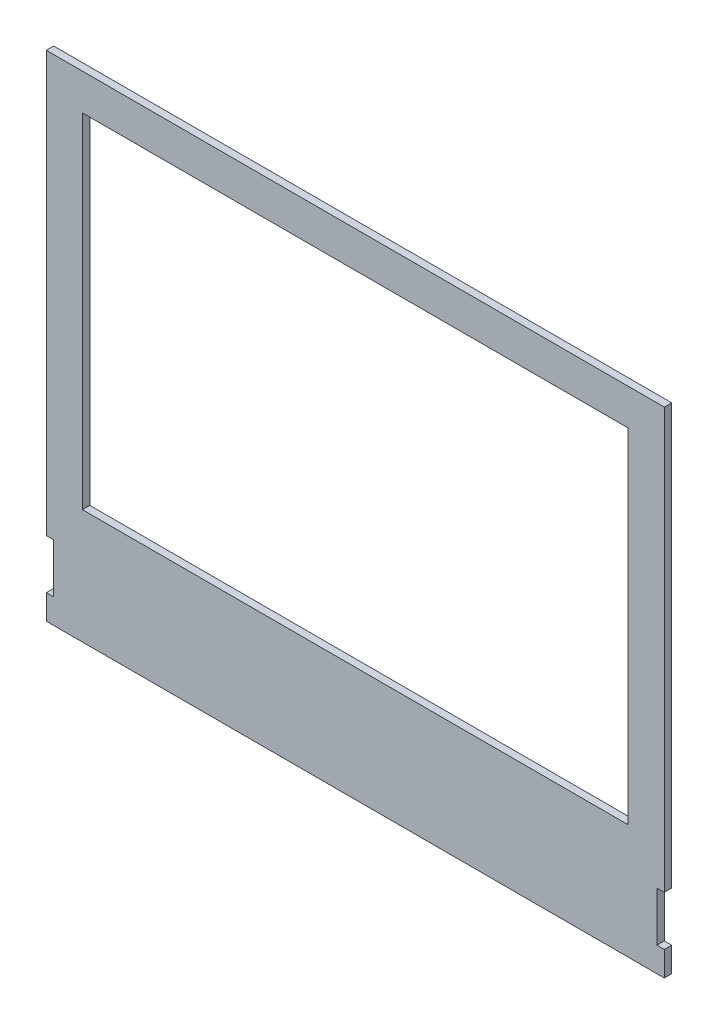
ISO-10303-21;
HEADER;
FILE_DESCRIPTION(('STEP AP214'),'2;1');
FILE_NAME('part.step','',(''),(''),'','','');
FILE_SCHEMA(('AUTOMOTIVE_DESIGN { 1 0 10303 214 1 1 1 1 }'));
ENDSEC;
DATA;
#1=APPLICATION_CONTEXT('core data for automotive mechanical design processes');
#2=APPLICATION_PROTOCOL_DEFINITION('international standard','automotive_design',2000,#1);
#3=PRODUCT_CONTEXT('',#1,'mechanical');
#4=PRODUCT('Part','Part','',(#3));
#5=PRODUCT_RELATED_PRODUCT_CATEGORY('part','',(#4));
#6=PRODUCT_DEFINITION_FORMATION('','',#4);
#7=PRODUCT_DEFINITION_CONTEXT('part definition',#1,'design');
#8=PRODUCT_DEFINITION('design','',#6,#7);
#9=PRODUCT_DEFINITION_SHAPE('','',#8);
#10=(LENGTH_UNIT() NAMED_UNIT(*) SI_UNIT(.MILLI.,.METRE.));
#11=(NAMED_UNIT(*) PLANE_ANGLE_UNIT() SI_UNIT($,.RADIAN.));
#12=(NAMED_UNIT(*) SI_UNIT($,.STERADIAN.) SOLID_ANGLE_UNIT());
#13=UNCERTAINTY_MEASURE_WITH_UNIT(LENGTH_MEASURE(1.E-05),#10,'distance_accuracy_value','');
#14=(GEOMETRIC_REPRESENTATION_CONTEXT(3) GLOBAL_UNCERTAINTY_ASSIGNED_CONTEXT((#13)) GLOBAL_UNIT_ASSIGNED_CONTEXT((#10,
#11,#12)) REPRESENTATION_CONTEXT('',''));
#15=CARTESIAN_POINT('',(0.,0.,0.));
#16=DIRECTION('',(0.,0.,1.));
#17=DIRECTION('',(1.,0.,0.));
#18=AXIS2_PLACEMENT_3D('',#15,#16,#17);
#19=CARTESIAN_POINT('',(250.,0.,3.));
#20=DIRECTION('',(-1.,0.,0.));
#21=DIRECTION('',(0.,0.,1.));
#22=AXIS2_PLACEMENT_3D('',#19,#20,#21);
#23=PLANE('',#22);
#24=DIRECTION('',(0.,1.,0.));
#25=VECTOR('',#24,1.);
#26=CARTESIAN_POINT('',(250.,0.,0.));
#27=LINE('',#26,#25);
#28=CARTESIAN_POINT('',(250.,0.,0.));
#29=VERTEX_POINT('',#28);
#30=CARTESIAN_POINT('',(250.,10.,0.));
#31=VERTEX_POINT('',#30);
#32=EDGE_CURVE('E184',#29,#31,#27,.T.);
#33=ORIENTED_EDGE('',*,*,#32,.T.);
#34=DIRECTION('',(0.,0.,1.));
#35=VECTOR('',#34,1.);
#36=CARTESIAN_POINT('',(250.,10.,-7.));
#37=LINE('',#36,#35);
#38=CARTESIAN_POINT('',(250.,10.,3.));
#39=VERTEX_POINT('',#38);
#40=EDGE_CURVE('E271',#31,#39,#37,.T.);
#41=ORIENTED_EDGE('',*,*,#40,.T.);
#42=DIRECTION('',(0.,1.,0.));
#43=VECTOR('',#42,1.);
#44=CARTESIAN_POINT('',(250.,0.,3.));
#45=LINE('',#44,#43);
#46=CARTESIAN_POINT('',(250.,0.,3.));
#47=VERTEX_POINT('',#46);
#48=EDGE_CURVE('E167',#47,#39,#45,.T.);
#49=ORIENTED_EDGE('',*,*,#48,.F.);
#50=DIRECTION('',(0.,0.,-1.));
#51=VECTOR('',#50,1.);
#52=CARTESIAN_POINT('',(250.,0.,3.));
#53=LINE('',#52,#51);
#54=EDGE_CURVE('E193',#47,#29,#53,.T.);
#55=ORIENTED_EDGE('',*,*,#54,.T.);
#56=EDGE_LOOP('',(#33,#41,#49,#55));
#57=FACE_BOUND('',#56,.T.);
#58=ADVANCED_FACE('F32',(#57),#23,.F.);
#59=CARTESIAN_POINT('',(0.,0.,3.));
#60=DIRECTION('',(1.,0.,0.));
#61=DIRECTION('',(0.,0.,-1.));
#62=AXIS2_PLACEMENT_3D('',#59,#60,#61);
#63=PLANE('',#62);
#64=DIRECTION('',(0.,-1.,0.));
#65=VECTOR('',#64,1.);
#66=CARTESIAN_POINT('',(0.,0.,0.));
#67=LINE('',#66,#65);
#68=CARTESIAN_POINT('',(0.,200.,0.));
#69=VERTEX_POINT('',#68);
#70=CARTESIAN_POINT('',(0.,30.,0.));
#71=VERTEX_POINT('',#70);
#72=EDGE_CURVE('E177',#69,#71,#67,.T.);
#73=ORIENTED_EDGE('',*,*,#72,.T.);
#74=DIRECTION('',(0.,0.,1.));
#75=VECTOR('',#74,1.);
#76=CARTESIAN_POINT('',(0.,30.,-7.));
#77=LINE('',#76,#75);
#78=CARTESIAN_POINT('',(0.,30.,3.));
#79=VERTEX_POINT('',#78);
#80=EDGE_CURVE('E249',#71,#79,#77,.T.);
#81=ORIENTED_EDGE('',*,*,#80,.T.);
#82=DIRECTION('',(0.,-1.,0.));
#83=VECTOR('',#82,1.);
#84=CARTESIAN_POINT('',(0.,0.,3.));
#85=LINE('',#84,#83);
#86=CARTESIAN_POINT('',(0.,200.,3.));
#87=VERTEX_POINT('',#86);
#88=EDGE_CURVE('E171',#87,#79,#85,.T.);
#89=ORIENTED_EDGE('',*,*,#88,.F.);
#90=DIRECTION('',(0.,0.,-1.));
#91=VECTOR('',#90,1.);
#92=CARTESIAN_POINT('',(0.,200.,3.));
#93=LINE('',#92,#91);
#94=EDGE_CURVE('E176',#87,#69,#93,.T.);
#95=ORIENTED_EDGE('',*,*,#94,.T.);
#96=EDGE_LOOP('',(#73,#81,#89,#95));
#97=FACE_BOUND('',#96,.T.);
#98=ADVANCED_FACE('F302',(#97),#63,.F.);
#99=CARTESIAN_POINT('',(0.,10.,3.));
#100=VERTEX_POINT('',#99);
#101=CARTESIAN_POINT('',(0.,0.,3.));
#102=VERTEX_POINT('',#101);
#103=EDGE_CURVE('E189',#100,#102,#85,.T.);
#104=ORIENTED_EDGE('',*,*,#103,.F.);
#105=DIRECTION('',(0.,0.,1.));
#106=VECTOR('',#105,1.);
#107=CARTESIAN_POINT('',(0.,10.,-7.));
#108=LINE('',#107,#106);
#109=CARTESIAN_POINT('',(0.,10.,0.));
#110=VERTEX_POINT('',#109);
#111=EDGE_CURVE('E260',#110,#100,#108,.T.);
#112=ORIENTED_EDGE('',*,*,#111,.F.);
#113=CARTESIAN_POINT('',(0.,0.,0.));
#114=VERTEX_POINT('',#113);
#115=EDGE_CURVE('E181',#110,#114,#67,.T.);
#116=ORIENTED_EDGE('',*,*,#115,.T.);
#117=DIRECTION('',(0.,0.,-1.));
#118=VECTOR('',#117,1.);
#119=CARTESIAN_POINT('',(0.,0.,3.));
#120=LINE('',#119,#118);
#121=EDGE_CURVE('E196',#102,#114,#120,.T.);
#122=ORIENTED_EDGE('',*,*,#121,.F.);
#123=EDGE_LOOP('',(#104,#112,#116,#122));
#124=FACE_BOUND('',#123,.T.);
#125=ADVANCED_FACE('F34',(#124),#63,.F.);
#126=CARTESIAN_POINT('',(0.,0.,3.));
#127=DIRECTION('',(0.,1.,0.));
#128=DIRECTION('',(0.,0.,1.));
#129=AXIS2_PLACEMENT_3D('',#126,#127,#128);
#130=PLANE('',#129);
#131=DIRECTION('',(1.,0.,0.));
#132=VECTOR('',#131,1.);
#133=CARTESIAN_POINT('',(0.,0.,0.));
#134=LINE('',#133,#132);
#135=EDGE_CURVE('E180',#114,#29,#134,.T.);
#136=ORIENTED_EDGE('',*,*,#135,.T.);
#137=ORIENTED_EDGE('',*,*,#54,.F.);
#138=DIRECTION('',(1.,0.,0.));
#139=VECTOR('',#138,1.);
#140=CARTESIAN_POINT('',(0.,0.,3.));
#141=LINE('',#140,#139);
#142=EDGE_CURVE('E168',#102,#47,#141,.T.);
#143=ORIENTED_EDGE('',*,*,#142,.F.);
#144=ORIENTED_EDGE('',*,*,#121,.T.);
#145=EDGE_LOOP('',(#136,#137,#143,#144));
#146=FACE_BOUND('',#145,.T.);
#147=ADVANCED_FACE('F290',(#146),#130,.F.);
#148=CARTESIAN_POINT('',(250.,30.,3.));
#149=VERTEX_POINT('',#148);
#150=CARTESIAN_POINT('',(250.,200.,3.));
#151=VERTEX_POINT('',#150);
#152=EDGE_CURVE('E157',#149,#151,#45,.T.);
#153=ORIENTED_EDGE('',*,*,#152,.F.);
#154=DIRECTION('',(0.,0.,1.));
#155=VECTOR('',#154,1.);
#156=CARTESIAN_POINT('',(250.,30.,-7.));
#157=LINE('',#156,#155);
#158=CARTESIAN_POINT('',(250.,30.,0.));
#159=VERTEX_POINT('',#158);
#160=EDGE_CURVE('E142',#159,#149,#157,.T.);
#161=ORIENTED_EDGE('',*,*,#160,.F.);
#162=CARTESIAN_POINT('',(250.,200.,0.));
#163=VERTEX_POINT('',#162);
#164=EDGE_CURVE('E183',#159,#163,#27,.T.);
#165=ORIENTED_EDGE('',*,*,#164,.T.);
#166=DIRECTION('',(0.,0.,-1.));
#167=VECTOR('',#166,1.);
#168=CARTESIAN_POINT('',(250.,200.,3.));
#169=LINE('',#168,#167);
#170=EDGE_CURVE('E165',#151,#163,#169,.T.);
#171=ORIENTED_EDGE('',*,*,#170,.F.);
#172=EDGE_LOOP('',(#153,#161,#165,#171));
#173=FACE_BOUND('',#172,.T.);
#174=ADVANCED_FACE('F163',(#173),#23,.F.);
#175=CARTESIAN_POINT('',(0.,200.,3.));
#176=DIRECTION('',(0.,-1.,0.));
#177=DIRECTION('',(0.,0.,-1.));
#178=AXIS2_PLACEMENT_3D('',#175,#176,#177);
#179=PLANE('',#178);
#180=DIRECTION('',(-1.,0.,0.));
#181=VECTOR('',#180,1.);
#182=CARTESIAN_POINT('',(0.,200.,0.));
#183=LINE('',#182,#181);
#184=EDGE_CURVE('E187',#163,#69,#183,.T.);
#185=ORIENTED_EDGE('',*,*,#184,.T.);
#186=ORIENTED_EDGE('',*,*,#94,.F.);
#187=DIRECTION('',(-1.,0.,0.));
#188=VECTOR('',#187,1.);
#189=CARTESIAN_POINT('',(0.,200.,3.));
#190=LINE('',#189,#188);
#191=EDGE_CURVE('E170',#151,#87,#190,.T.);
#192=ORIENTED_EDGE('',*,*,#191,.F.);
#193=ORIENTED_EDGE('',*,*,#170,.T.);
#194=EDGE_LOOP('',(#185,#186,#192,#193));
#195=FACE_BOUND('',#194,.T.);
#196=ADVANCED_FACE('F217',(#195),#179,.F.);
#197=CARTESIAN_POINT('',(0.,0.,3.));
#198=DIRECTION('',(0.,0.,-1.));
#199=DIRECTION('',(-1.,0.,0.));
#200=AXIS2_PLACEMENT_3D('',#197,#198,#199);
#201=PLANE('',#200);
#202=DIRECTION('',(1.,0.,0.));
#203=VECTOR('',#202,1.);
#204=CARTESIAN_POINT('',(14.62,46.38,3.));
#205=LINE('',#204,#203);
#206=CARTESIAN_POINT('',(14.62,46.38,3.));
#207=VERTEX_POINT('',#206);
#208=CARTESIAN_POINT('',(235.38,46.38,3.));
#209=VERTEX_POINT('',#208);
#210=EDGE_CURVE('E244',#207,#209,#205,.T.);
#211=ORIENTED_EDGE('',*,*,#210,.F.);
#212=DIRECTION('',(0.,-1.,0.));
#213=VECTOR('',#212,1.);
#214=CARTESIAN_POINT('',(14.62,185.38,3.));
#215=LINE('',#214,#213);
#216=CARTESIAN_POINT('',(14.62,185.38,3.));
#217=VERTEX_POINT('',#216);
#218=EDGE_CURVE('E247',#217,#207,#215,.T.);
#219=ORIENTED_EDGE('',*,*,#218,.F.);
#220=DIRECTION('',(-1.,0.,0.));
#221=VECTOR('',#220,1.);
#222=CARTESIAN_POINT('',(14.62,185.38,3.));
#223=LINE('',#222,#221);
#224=CARTESIAN_POINT('',(235.38,185.38,3.));
#225=VERTEX_POINT('',#224);
#226=EDGE_CURVE('E237',#225,#217,#223,.T.);
#227=ORIENTED_EDGE('',*,*,#226,.F.);
#228=DIRECTION('',(0.,1.,0.));
#229=VECTOR('',#228,1.);
#230=CARTESIAN_POINT('',(235.38,185.38,3.));
#231=LINE('',#230,#229);
#232=EDGE_CURVE('E241',#209,#225,#231,.T.);
#233=ORIENTED_EDGE('',*,*,#232,.F.);
#234=EDGE_LOOP('',(#211,#219,#227,#233));
#235=FACE_BOUND('',#234,.T.);
#236=ORIENTED_EDGE('',*,*,#48,.T.);
#237=DIRECTION('',(1.,0.,0.));
#238=VECTOR('',#237,1.);
#239=CARTESIAN_POINT('',(250.,10.,3.));
#240=LINE('',#239,#238);
#241=CARTESIAN_POINT('',(247.,10.,3.));
#242=VERTEX_POINT('',#241);
#243=EDGE_CURVE('E152',#242,#39,#240,.T.);
#244=ORIENTED_EDGE('',*,*,#243,.F.);
#245=DIRECTION('',(0.,-1.,0.));
#246=VECTOR('',#245,1.);
#247=CARTESIAN_POINT('',(247.,30.,3.));
#248=LINE('',#247,#246);
#249=CARTESIAN_POINT('',(247.,30.,3.));
#250=VERTEX_POINT('',#249);
#251=EDGE_CURVE('E161',#250,#242,#248,.T.);
#252=ORIENTED_EDGE('',*,*,#251,.F.);
#253=DIRECTION('',(-1.,0.,0.));
#254=VECTOR('',#253,1.);
#255=CARTESIAN_POINT('',(250.,30.,3.));
#256=LINE('',#255,#254);
#257=EDGE_CURVE('E145',#149,#250,#256,.T.);
#258=ORIENTED_EDGE('',*,*,#257,.F.);
#259=ORIENTED_EDGE('',*,*,#152,.T.);
#260=ORIENTED_EDGE('',*,*,#191,.T.);
#261=ORIENTED_EDGE('',*,*,#88,.T.);
#262=DIRECTION('',(-1.,0.,0.));
#263=VECTOR('',#262,1.);
#264=CARTESIAN_POINT('',(0.,30.,3.));
#265=LINE('',#264,#263);
#266=CARTESIAN_POINT('',(3.,30.,3.));
#267=VERTEX_POINT('',#266);
#268=EDGE_CURVE('E223',#267,#79,#265,.T.);
#269=ORIENTED_EDGE('',*,*,#268,.F.);
#270=DIRECTION('',(0.,1.,0.));
#271=VECTOR('',#270,1.);
#272=CARTESIAN_POINT('',(3.,10.,3.));
#273=LINE('',#272,#271);
#274=CARTESIAN_POINT('',(3.,10.,3.));
#275=VERTEX_POINT('',#274);
#276=EDGE_CURVE('E267',#275,#267,#273,.T.);
#277=ORIENTED_EDGE('',*,*,#276,.F.);
#278=DIRECTION('',(1.,0.,0.));
#279=VECTOR('',#278,1.);
#280=CARTESIAN_POINT('',(0.,10.,3.));
#281=LINE('',#280,#279);
#282=EDGE_CURVE('E270',#100,#275,#281,.T.);
#283=ORIENTED_EDGE('',*,*,#282,.F.);
#284=ORIENTED_EDGE('',*,*,#103,.T.);
#285=ORIENTED_EDGE('',*,*,#142,.T.);
#286=EDGE_LOOP('',(#236,#244,#252,#258,#259,#260,#261,#269,#277,#283,#284,#285));
#287=FACE_BOUND('',#286,.T.);
#288=ADVANCED_FACE('F156',(#235,#287),#201,.F.);
#289=CARTESIAN_POINT('',(0.,0.,0.));
#290=DIRECTION('',(0.,0.,-1.));
#291=DIRECTION('',(-1.,0.,0.));
#292=AXIS2_PLACEMENT_3D('',#289,#290,#291);
#293=PLANE('',#292);
#294=DIRECTION('',(-1.,0.,0.));
#295=VECTOR('',#294,1.);
#296=CARTESIAN_POINT('',(0.,10.,0.));
#297=LINE('',#296,#295);
#298=CARTESIAN_POINT('',(247.,10.,0.));
#299=VERTEX_POINT('',#298);
#300=EDGE_CURVE('E11',#31,#299,#297,.T.);
#301=ORIENTED_EDGE('',*,*,#300,.F.);
#302=ORIENTED_EDGE('',*,*,#32,.F.);
#303=ORIENTED_EDGE('',*,*,#135,.F.);
#304=ORIENTED_EDGE('',*,*,#115,.F.);
#305=DIRECTION('',(-1.,0.,0.));
#306=VECTOR('',#305,1.);
#307=CARTESIAN_POINT('',(0.,10.,0.));
#308=LINE('',#307,#306);
#309=CARTESIAN_POINT('',(3.,10.,0.));
#310=VERTEX_POINT('',#309);
#311=EDGE_CURVE('E199',#310,#110,#308,.T.);
#312=ORIENTED_EDGE('',*,*,#311,.F.);
#313=DIRECTION('',(0.,-1.,0.));
#314=VECTOR('',#313,1.);
#315=CARTESIAN_POINT('',(3.,0.,0.));
#316=LINE('',#315,#314);
#317=CARTESIAN_POINT('',(3.,30.,0.));
#318=VERTEX_POINT('',#317);
#319=EDGE_CURVE('E201',#318,#310,#316,.T.);
#320=ORIENTED_EDGE('',*,*,#319,.F.);
#321=DIRECTION('',(1.,0.,0.));
#322=VECTOR('',#321,1.);
#323=CARTESIAN_POINT('',(0.,30.,0.));
#324=LINE('',#323,#322);
#325=EDGE_CURVE('E203',#71,#318,#324,.T.);
#326=ORIENTED_EDGE('',*,*,#325,.F.);
#327=ORIENTED_EDGE('',*,*,#72,.F.);
#328=ORIENTED_EDGE('',*,*,#184,.F.);
#329=ORIENTED_EDGE('',*,*,#164,.F.);
#330=DIRECTION('',(1.,0.,0.));
#331=VECTOR('',#330,1.);
#332=CARTESIAN_POINT('',(0.,29.9999999999997,0.));
#333=LINE('',#332,#331);
#334=CARTESIAN_POINT('',(247.,30.,0.));
#335=VERTEX_POINT('',#334);
#336=EDGE_CURVE('E148',#335,#159,#333,.T.);
#337=ORIENTED_EDGE('',*,*,#336,.F.);
#338=DIRECTION('',(0.,1.,0.));
#339=VECTOR('',#338,1.);
#340=CARTESIAN_POINT('',(247.,0.,0.));
#341=LINE('',#340,#339);
#342=EDGE_CURVE('E40',#299,#335,#341,.T.);
#343=ORIENTED_EDGE('',*,*,#342,.F.);
#344=EDGE_LOOP('',(#301,#302,#303,#304,#312,#320,#326,#327,#328,#329,#337,#343));
#345=FACE_BOUND('',#344,.T.);
#346=DIRECTION('',(0.,-1.,0.));
#347=VECTOR('',#346,1.);
#348=CARTESIAN_POINT('',(14.62,185.38,0.));
#349=LINE('',#348,#347);
#350=CARTESIAN_POINT('',(14.62,185.38,0.));
#351=VERTEX_POINT('',#350);
#352=CARTESIAN_POINT('',(14.62,46.38,0.));
#353=VERTEX_POINT('',#352);
#354=EDGE_CURVE('E240',#351,#353,#349,.T.);
#355=ORIENTED_EDGE('',*,*,#354,.T.);
#356=DIRECTION('',(1.,0.,0.));
#357=VECTOR('',#356,1.);
#358=CARTESIAN_POINT('',(14.62,46.38,0.));
#359=LINE('',#358,#357);
#360=CARTESIAN_POINT('',(235.38,46.38,0.));
#361=VERTEX_POINT('',#360);
#362=EDGE_CURVE('E255',#353,#361,#359,.T.);
#363=ORIENTED_EDGE('',*,*,#362,.T.);
#364=DIRECTION('',(0.,1.,0.));
#365=VECTOR('',#364,1.);
#366=CARTESIAN_POINT('',(235.38,185.38,0.));
#367=LINE('',#366,#365);
#368=CARTESIAN_POINT('',(235.38,185.38,0.));
#369=VERTEX_POINT('',#368);
#370=EDGE_CURVE('E252',#361,#369,#367,.T.);
#371=ORIENTED_EDGE('',*,*,#370,.T.);
#372=DIRECTION('',(-1.,0.,0.));
#373=VECTOR('',#372,1.);
#374=CARTESIAN_POINT('',(14.62,185.38,0.));
#375=LINE('',#374,#373);
#376=EDGE_CURVE('E231',#369,#351,#375,.T.);
#377=ORIENTED_EDGE('',*,*,#376,.T.);
#378=EDGE_LOOP('',(#355,#363,#371,#377));
#379=FACE_BOUND('',#378,.T.);
#380=ADVANCED_FACE('F212',(#345,#379),#293,.T.);
#381=CARTESIAN_POINT('',(14.62,185.38,0.));
#382=DIRECTION('',(-1.,0.,0.));
#383=DIRECTION('',(0.,-1.,0.));
#384=AXIS2_PLACEMENT_3D('',#381,#382,#383);
#385=PLANE('',#384);
#386=ORIENTED_EDGE('',*,*,#218,.T.);
#387=DIRECTION('',(0.,0.,1.));
#388=VECTOR('',#387,1.);
#389=CARTESIAN_POINT('',(14.62,46.38,0.));
#390=LINE('',#389,#388);
#391=EDGE_CURVE('E227',#353,#207,#390,.T.);
#392=ORIENTED_EDGE('',*,*,#391,.F.);
#393=ORIENTED_EDGE('',*,*,#354,.F.);
#394=DIRECTION('',(0.,0.,1.));
#395=VECTOR('',#394,1.);
#396=CARTESIAN_POINT('',(14.62,185.38,0.));
#397=LINE('',#396,#395);
#398=EDGE_CURVE('E235',#351,#217,#397,.T.);
#399=ORIENTED_EDGE('',*,*,#398,.T.);
#400=EDGE_LOOP('',(#386,#392,#393,#399));
#401=FACE_BOUND('',#400,.T.);
#402=ADVANCED_FACE('F366',(#401),#385,.F.);
#403=CARTESIAN_POINT('',(14.62,185.38,0.));
#404=DIRECTION('',(0.,1.,0.));
#405=DIRECTION('',(0.,0.,1.));
#406=AXIS2_PLACEMENT_3D('',#403,#404,#405);
#407=PLANE('',#406);
#408=ORIENTED_EDGE('',*,*,#226,.T.);
#409=ORIENTED_EDGE('',*,*,#398,.F.);
#410=ORIENTED_EDGE('',*,*,#376,.F.);
#411=DIRECTION('',(0.,0.,1.));
#412=VECTOR('',#411,1.);
#413=CARTESIAN_POINT('',(235.38,185.38,0.));
#414=LINE('',#413,#412);
#415=EDGE_CURVE('E233',#369,#225,#414,.T.);
#416=ORIENTED_EDGE('',*,*,#415,.T.);
#417=EDGE_LOOP('',(#408,#409,#410,#416));
#418=FACE_BOUND('',#417,.T.);
#419=ADVANCED_FACE('F356',(#418),#407,.F.);
#420=CARTESIAN_POINT('',(235.38,185.38,0.));
#421=DIRECTION('',(1.,0.,0.));
#422=DIRECTION('',(0.,1.,0.));
#423=AXIS2_PLACEMENT_3D('',#420,#421,#422);
#424=PLANE('',#423);
#425=ORIENTED_EDGE('',*,*,#232,.T.);
#426=ORIENTED_EDGE('',*,*,#415,.F.);
#427=ORIENTED_EDGE('',*,*,#370,.F.);
#428=DIRECTION('',(0.,0.,1.));
#429=VECTOR('',#428,1.);
#430=CARTESIAN_POINT('',(235.38,46.38,0.));
#431=LINE('',#430,#429);
#432=EDGE_CURVE('E230',#361,#209,#431,.T.);
#433=ORIENTED_EDGE('',*,*,#432,.T.);
#434=EDGE_LOOP('',(#425,#426,#427,#433));
#435=FACE_BOUND('',#434,.T.);
#436=ADVANCED_FACE('F312',(#435),#424,.F.);
#437=CARTESIAN_POINT('',(14.62,46.38,0.));
#438=DIRECTION('',(0.,-1.,0.));
#439=DIRECTION('',(0.,0.,-1.));
#440=AXIS2_PLACEMENT_3D('',#437,#438,#439);
#441=PLANE('',#440);
#442=ORIENTED_EDGE('',*,*,#210,.T.);
#443=ORIENTED_EDGE('',*,*,#432,.F.);
#444=ORIENTED_EDGE('',*,*,#362,.F.);
#445=ORIENTED_EDGE('',*,*,#391,.T.);
#446=EDGE_LOOP('',(#442,#443,#444,#445));
#447=FACE_BOUND('',#446,.T.);
#448=ADVANCED_FACE('F305',(#447),#441,.F.);
#449=CARTESIAN_POINT('',(0.,30.,-7.));
#450=DIRECTION('',(0.,1.,0.));
#451=DIRECTION('',(0.,0.,1.));
#452=AXIS2_PLACEMENT_3D('',#449,#450,#451);
#453=PLANE('',#452);
#454=ORIENTED_EDGE('',*,*,#325,.T.);
#455=DIRECTION('',(0.,0.,1.));
#456=VECTOR('',#455,1.);
#457=CARTESIAN_POINT('',(3.,30.,-7.));
#458=LINE('',#457,#456);
#459=EDGE_CURVE('E263',#318,#267,#458,.T.);
#460=ORIENTED_EDGE('',*,*,#459,.T.);
#461=ORIENTED_EDGE('',*,*,#268,.T.);
#462=ORIENTED_EDGE('',*,*,#80,.F.);
#463=EDGE_LOOP('',(#454,#460,#461,#462));
#464=FACE_BOUND('',#463,.T.);
#465=ADVANCED_FACE('F303',(#464),#453,.F.);
#466=CARTESIAN_POINT('',(3.,10.,-7.));
#467=DIRECTION('',(1.,0.,0.));
#468=DIRECTION('',(0.,1.,0.));
#469=AXIS2_PLACEMENT_3D('',#466,#467,#468);
#470=PLANE('',#469);
#471=ORIENTED_EDGE('',*,*,#319,.T.);
#472=DIRECTION('',(0.,0.,1.));
#473=VECTOR('',#472,1.);
#474=CARTESIAN_POINT('',(3.,10.,-7.));
#475=LINE('',#474,#473);
#476=EDGE_CURVE('E55',#310,#275,#475,.T.);
#477=ORIENTED_EDGE('',*,*,#476,.T.);
#478=ORIENTED_EDGE('',*,*,#276,.T.);
#479=ORIENTED_EDGE('',*,*,#459,.F.);
#480=EDGE_LOOP('',(#471,#477,#478,#479));
#481=FACE_BOUND('',#480,.T.);
#482=ADVANCED_FACE('F298',(#481),#470,.F.);
#483=CARTESIAN_POINT('',(0.,10.,-7.));
#484=DIRECTION('',(0.,-1.,0.));
#485=DIRECTION('',(1.,0.,0.));
#486=AXIS2_PLACEMENT_3D('',#483,#484,#485);
#487=PLANE('',#486);
#488=ORIENTED_EDGE('',*,*,#311,.T.);
#489=ORIENTED_EDGE('',*,*,#111,.T.);
#490=ORIENTED_EDGE('',*,*,#282,.T.);
#491=ORIENTED_EDGE('',*,*,#476,.F.);
#492=EDGE_LOOP('',(#488,#489,#490,#491));
#493=FACE_BOUND('',#492,.T.);
#494=ADVANCED_FACE('F295',(#493),#487,.F.);
#495=CARTESIAN_POINT('',(250.,10.,-7.));
#496=DIRECTION('',(0.,-1.,0.));
#497=DIRECTION('',(0.,0.,-1.));
#498=AXIS2_PLACEMENT_3D('',#495,#496,#497);
#499=PLANE('',#498);
#500=ORIENTED_EDGE('',*,*,#300,.T.);
#501=DIRECTION('',(0.,0.,1.));
#502=VECTOR('',#501,1.);
#503=CARTESIAN_POINT('',(247.,10.,-7.));
#504=LINE('',#503,#502);
#505=EDGE_CURVE('E209',#299,#242,#504,.T.);
#506=ORIENTED_EDGE('',*,*,#505,.T.);
#507=ORIENTED_EDGE('',*,*,#243,.T.);
#508=ORIENTED_EDGE('',*,*,#40,.F.);
#509=EDGE_LOOP('',(#500,#506,#507,#508));
#510=FACE_BOUND('',#509,.T.);
#511=ADVANCED_FACE('F280',(#510),#499,.F.);
#512=CARTESIAN_POINT('',(247.,30.,-7.));
#513=DIRECTION('',(-1.,0.,0.));
#514=DIRECTION('',(0.,0.,1.));
#515=AXIS2_PLACEMENT_3D('',#512,#513,#514);
#516=PLANE('',#515);
#517=ORIENTED_EDGE('',*,*,#342,.T.);
#518=DIRECTION('',(0.,0.,1.));
#519=VECTOR('',#518,1.);
#520=CARTESIAN_POINT('',(247.,30.,-7.));
#521=LINE('',#520,#519);
#522=EDGE_CURVE('E47',#335,#250,#521,.T.);
#523=ORIENTED_EDGE('',*,*,#522,.T.);
#524=ORIENTED_EDGE('',*,*,#251,.T.);
#525=ORIENTED_EDGE('',*,*,#505,.F.);
#526=EDGE_LOOP('',(#517,#523,#524,#525));
#527=FACE_BOUND('',#526,.T.);
#528=ADVANCED_FACE('F208',(#527),#516,.F.);
#529=CARTESIAN_POINT('',(250.,30.,-7.));
#530=DIRECTION('',(0.,1.,0.));
#531=DIRECTION('',(-1.,0.,0.));
#532=AXIS2_PLACEMENT_3D('',#529,#530,#531);
#533=PLANE('',#532);
#534=ORIENTED_EDGE('',*,*,#336,.T.);
#535=ORIENTED_EDGE('',*,*,#160,.T.);
#536=ORIENTED_EDGE('',*,*,#257,.T.);
#537=ORIENTED_EDGE('',*,*,#522,.F.);
#538=EDGE_LOOP('',(#534,#535,#536,#537));
#539=FACE_BOUND('',#538,.T.);
#540=ADVANCED_FACE('F144',(#539),#533,.F.);
#541=CLOSED_SHELL('',(#58,#98,#125,#147,#174,#196,#288,#380,#402,#419,#436,#448,#465,#482,#494,
#511,#528,#540));
#542=MANIFOLD_SOLID_BREP('B2',#541);
#543=ADVANCED_BREP_SHAPE_REPRESENTATION('',(#18,#542),#14);
#544=SHAPE_DEFINITION_REPRESENTATION(#9,#543);
ENDSEC;
END-ISO-10303-21;
